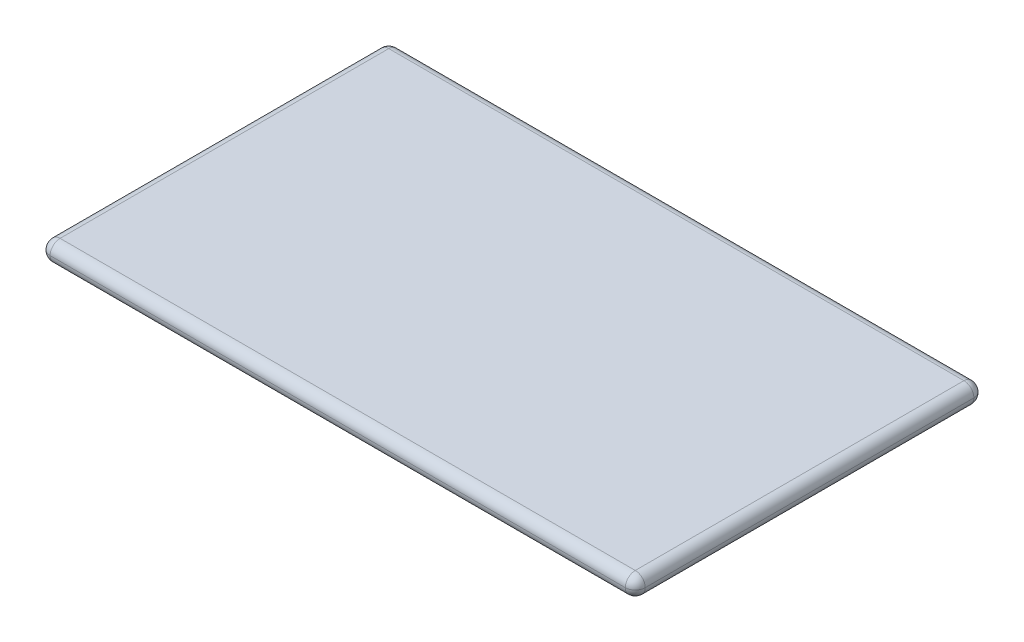
ISO-10303-21;
HEADER;
FILE_DESCRIPTION(('STEP AP214'),'2;1');
FILE_NAME('part.step','',(''),(''),'','','');
FILE_SCHEMA(('AUTOMOTIVE_DESIGN { 1 0 10303 214 1 1 1 1 }'));
ENDSEC;
DATA;
#1=APPLICATION_CONTEXT('core data for automotive mechanical design processes');
#2=APPLICATION_PROTOCOL_DEFINITION('international standard','automotive_design',2000,#1);
#3=PRODUCT_CONTEXT('',#1,'mechanical');
#4=PRODUCT('Part','Part','',(#3));
#5=PRODUCT_RELATED_PRODUCT_CATEGORY('part','',(#4));
#6=PRODUCT_DEFINITION_FORMATION('','',#4);
#7=PRODUCT_DEFINITION_CONTEXT('part definition',#1,'design');
#8=PRODUCT_DEFINITION('design','',#6,#7);
#9=PRODUCT_DEFINITION_SHAPE('','',#8);
#10=(LENGTH_UNIT() NAMED_UNIT(*) SI_UNIT(.MILLI.,.METRE.));
#11=(NAMED_UNIT(*) PLANE_ANGLE_UNIT() SI_UNIT($,.RADIAN.));
#12=(NAMED_UNIT(*) SI_UNIT($,.STERADIAN.) SOLID_ANGLE_UNIT());
#13=UNCERTAINTY_MEASURE_WITH_UNIT(LENGTH_MEASURE(1.E-05),#10,'distance_accuracy_value','');
#14=(GEOMETRIC_REPRESENTATION_CONTEXT(3) GLOBAL_UNCERTAINTY_ASSIGNED_CONTEXT((#13)) GLOBAL_UNIT_ASSIGNED_CONTEXT((#10,
#11,#12)) REPRESENTATION_CONTEXT('',''));
#15=CARTESIAN_POINT('',(0.,0.,0.));
#16=DIRECTION('',(0.,0.,1.));
#17=DIRECTION('',(1.,0.,0.));
#18=AXIS2_PLACEMENT_3D('',#15,#16,#17);
#19=CARTESIAN_POINT('',(0.,0.2032,3.556));
#20=DIRECTION('',(0.,1.,0.));
#21=DIRECTION('',(-1.,0.,0.));
#22=AXIS2_PLACEMENT_3D('',#19,#20,#21);
#23=PLANE('',#22);
#24=DIRECTION('',(0.,0.,-1.));
#25=VECTOR('',#24,1.);
#26=CARTESIAN_POINT('',(5.8674,0.2032,3.556));
#27=LINE('',#26,#25);
#28=CARTESIAN_POINT('',(5.8674,0.2032,3.3528));
#29=VERTEX_POINT('',#28);
#30=CARTESIAN_POINT('',(5.8674,0.2032,-3.3528));
#31=VERTEX_POINT('',#30);
#32=EDGE_CURVE('E45',#29,#31,#27,.T.);
#33=ORIENTED_EDGE('',*,*,#32,.T.);
#34=DIRECTION('',(1.,0.,0.));
#35=VECTOR('',#34,1.);
#36=CARTESIAN_POINT('',(-6.0706,0.2032,-3.3528));
#37=LINE('',#36,#35);
#38=CARTESIAN_POINT('',(-5.8674,0.2032,-3.3528));
#39=VERTEX_POINT('',#38);
#40=EDGE_CURVE('E11',#31,#39,#37,.F.);
#41=ORIENTED_EDGE('',*,*,#40,.T.);
#42=DIRECTION('',(0.,0.,-1.));
#43=VECTOR('',#42,1.);
#44=CARTESIAN_POINT('',(-5.8674,0.2032,3.556));
#45=LINE('',#44,#43);
#46=CARTESIAN_POINT('',(-5.8674,0.2032,3.3528));
#47=VERTEX_POINT('',#46);
#48=EDGE_CURVE('E117',#39,#47,#45,.F.);
#49=ORIENTED_EDGE('',*,*,#48,.T.);
#50=DIRECTION('',(1.,0.,0.));
#51=VECTOR('',#50,1.);
#52=CARTESIAN_POINT('',(0.,0.2032,3.3528));
#53=LINE('',#52,#51);
#54=EDGE_CURVE('E115',#47,#29,#53,.T.);
#55=ORIENTED_EDGE('',*,*,#54,.T.);
#56=EDGE_LOOP('',(#33,#41,#49,#55));
#57=FACE_BOUND('',#56,.T.);
#58=ADVANCED_FACE('F35',(#57),#23,.T.);
#59=CARTESIAN_POINT('',(0.,-0.2032,3.556));
#60=DIRECTION('',(0.,1.,0.));
#61=DIRECTION('',(-1.,0.,0.));
#62=AXIS2_PLACEMENT_3D('',#59,#60,#61);
#63=PLANE('',#62);
#64=DIRECTION('',(0.,0.,-1.));
#65=VECTOR('',#64,1.);
#66=CARTESIAN_POINT('',(-5.8674,-0.2032,3.556));
#67=LINE('',#66,#65);
#68=CARTESIAN_POINT('',(-5.8674,-0.2032,3.3528));
#69=VERTEX_POINT('',#68);
#70=CARTESIAN_POINT('',(-5.8674,-0.2032,-3.3528));
#71=VERTEX_POINT('',#70);
#72=EDGE_CURVE('E190',#69,#71,#67,.T.);
#73=ORIENTED_EDGE('',*,*,#72,.T.);
#74=DIRECTION('',(1.,0.,0.));
#75=VECTOR('',#74,1.);
#76=CARTESIAN_POINT('',(0.,-0.2032,-3.3528));
#77=LINE('',#76,#75);
#78=CARTESIAN_POINT('',(5.8674,-0.2032,-3.3528));
#79=VERTEX_POINT('',#78);
#80=EDGE_CURVE('E121',#71,#79,#77,.T.);
#81=ORIENTED_EDGE('',*,*,#80,.T.);
#82=DIRECTION('',(0.,0.,-1.));
#83=VECTOR('',#82,1.);
#84=CARTESIAN_POINT('',(5.8674,-0.2032,3.556));
#85=LINE('',#84,#83);
#86=CARTESIAN_POINT('',(5.8674,-0.2032,3.3528));
#87=VERTEX_POINT('',#86);
#88=EDGE_CURVE('E196',#79,#87,#85,.F.);
#89=ORIENTED_EDGE('',*,*,#88,.T.);
#90=DIRECTION('',(1.,0.,0.));
#91=VECTOR('',#90,1.);
#92=CARTESIAN_POINT('',(-6.0706,-0.2032,3.3528));
#93=LINE('',#92,#91);
#94=EDGE_CURVE('E187',#87,#69,#93,.F.);
#95=ORIENTED_EDGE('',*,*,#94,.T.);
#96=EDGE_LOOP('',(#73,#81,#89,#95));
#97=FACE_BOUND('',#96,.T.);
#98=ADVANCED_FACE('F202',(#97),#63,.F.);
#99=CARTESIAN_POINT('',(-5.8674,0.,3.556));
#100=DIRECTION('',(0.,0.,1.));
#101=DIRECTION('',(1.,0.,0.));
#102=AXIS2_PLACEMENT_3D('',#99,#100,#101);
#103=CYLINDRICAL_SURFACE('',#102,0.2032);
#104=DIRECTION('',(0.,0.,-1.));
#105=VECTOR('',#104,1.);
#106=CARTESIAN_POINT('',(-6.0706,0.,-3.556));
#107=LINE('',#106,#105);
#108=CARTESIAN_POINT('',(-6.0706,0.,3.3528));
#109=VERTEX_POINT('',#108);
#110=CARTESIAN_POINT('',(-6.0706,0.,-3.3528));
#111=VERTEX_POINT('',#110);
#112=EDGE_CURVE('E180',#109,#111,#107,.T.);
#113=ORIENTED_EDGE('',*,*,#112,.F.);
#114=CARTESIAN_POINT('',(-5.8674,0.,3.3528));
#115=DIRECTION('',(0.,0.,1.));
#116=DIRECTION('',(1.,0.,0.));
#117=AXIS2_PLACEMENT_3D('',#114,#115,#116);
#118=CIRCLE('',#117,0.2032);
#119=EDGE_CURVE('E39',#47,#109,#118,.T.);
#120=ORIENTED_EDGE('',*,*,#119,.F.);
#121=ORIENTED_EDGE('',*,*,#48,.F.);
#122=CARTESIAN_POINT('',(-5.8674,0.,-3.3528));
#123=DIRECTION('',(0.,0.,-1.));
#124=DIRECTION('',(0.,1.,0.));
#125=AXIS2_PLACEMENT_3D('',#122,#123,#124);
#126=CIRCLE('',#125,0.2032);
#127=EDGE_CURVE('E82',#111,#39,#126,.T.);
#128=ORIENTED_EDGE('',*,*,#127,.F.);
#129=EDGE_LOOP('',(#113,#120,#121,#128));
#130=FACE_BOUND('',#129,.T.);
#131=ADVANCED_FACE('F37',(#130),#103,.T.);
#132=CARTESIAN_POINT('',(-5.8674,0.,3.3528));
#133=DIRECTION('',(0.,0.,1.));
#134=DIRECTION('',(1.,0.,0.));
#135=AXIS2_PLACEMENT_3D('',#132,#133,#134);
#136=SPHERICAL_SURFACE('',#135,0.2032);
#137=ORIENTED_EDGE('',*,*,#119,.T.);
#138=CARTESIAN_POINT('',(-5.8674,0.,3.3528));
#139=DIRECTION('',(0.,-1.,0.));
#140=DIRECTION('',(1.,0.,0.));
#141=AXIS2_PLACEMENT_3D('',#138,#139,#140);
#142=CIRCLE('',#141,0.2032);
#143=CARTESIAN_POINT('',(-5.8674,0.,3.556));
#144=VERTEX_POINT('',#143);
#145=EDGE_CURVE('E89',#144,#109,#142,.T.);
#146=ORIENTED_EDGE('',*,*,#145,.F.);
#147=CARTESIAN_POINT('',(-5.8674,0.,3.3528));
#148=DIRECTION('',(-1.,0.,0.));
#149=DIRECTION('',(0.,0.,1.));
#150=AXIS2_PLACEMENT_3D('',#147,#148,#149);
#151=CIRCLE('',#150,0.2032);
#152=EDGE_CURVE('E175',#47,#144,#151,.F.);
#153=ORIENTED_EDGE('',*,*,#152,.F.);
#154=EDGE_LOOP('',(#137,#146,#153));
#155=FACE_BOUND('',#154,.T.);
#156=ADVANCED_FACE('F217',(#155),#136,.T.);
#157=CARTESIAN_POINT('',(-5.8674,0.,-3.3528));
#158=DIRECTION('',(0.,0.,1.));
#159=DIRECTION('',(1.,0.,0.));
#160=AXIS2_PLACEMENT_3D('',#157,#158,#159);
#161=SPHERICAL_SURFACE('',#160,0.2032);
#162=CARTESIAN_POINT('',(-5.8674,0.,-3.3528));
#163=DIRECTION('',(0.,1.,0.));
#164=DIRECTION('',(-1.,0.,0.));
#165=AXIS2_PLACEMENT_3D('',#162,#163,#164);
#166=CIRCLE('',#165,0.2032);
#167=CARTESIAN_POINT('',(-5.8674,0.,-3.556));
#168=VERTEX_POINT('',#167);
#169=EDGE_CURVE('E183',#111,#168,#166,.F.);
#170=ORIENTED_EDGE('',*,*,#169,.F.);
#171=ORIENTED_EDGE('',*,*,#127,.T.);
#172=CARTESIAN_POINT('',(-5.8674,0.,-3.3528));
#173=DIRECTION('',(-1.,0.,0.));
#174=DIRECTION('',(0.,0.,1.));
#175=AXIS2_PLACEMENT_3D('',#172,#173,#174);
#176=CIRCLE('',#175,0.2032);
#177=EDGE_CURVE('E172',#168,#39,#176,.F.);
#178=ORIENTED_EDGE('',*,*,#177,.F.);
#179=EDGE_LOOP('',(#170,#171,#178));
#180=FACE_BOUND('',#179,.T.);
#181=ADVANCED_FACE('F327',(#180),#161,.T.);
#182=CARTESIAN_POINT('',(-5.8674,0.,3.556));
#183=DIRECTION('',(0.,0.,-1.));
#184=DIRECTION('',(-1.,0.,0.));
#185=AXIS2_PLACEMENT_3D('',#182,#183,#184);
#186=CYLINDRICAL_SURFACE('',#185,0.2032);
#187=CARTESIAN_POINT('',(-5.8674,0.,3.3528));
#188=DIRECTION('',(0.,0.,1.));
#189=DIRECTION('',(1.,0.,0.));
#190=AXIS2_PLACEMENT_3D('',#187,#188,#189);
#191=CIRCLE('',#190,0.2032);
#192=EDGE_CURVE('E178',#109,#69,#191,.T.);
#193=ORIENTED_EDGE('',*,*,#192,.F.);
#194=ORIENTED_EDGE('',*,*,#112,.T.);
#195=CARTESIAN_POINT('',(-5.8674,0.,-3.3528));
#196=DIRECTION('',(0.,0.,-1.));
#197=DIRECTION('',(-1.,0.,0.));
#198=AXIS2_PLACEMENT_3D('',#195,#196,#197);
#199=CIRCLE('',#198,0.2032);
#200=EDGE_CURVE('E169',#71,#111,#199,.T.);
#201=ORIENTED_EDGE('',*,*,#200,.F.);
#202=ORIENTED_EDGE('',*,*,#72,.F.);
#203=EDGE_LOOP('',(#193,#194,#201,#202));
#204=FACE_BOUND('',#203,.T.);
#205=ADVANCED_FACE('F319',(#204),#186,.T.);
#206=CARTESIAN_POINT('',(-5.8674,0.,3.3528));
#207=DIRECTION('',(0.,0.,1.));
#208=DIRECTION('',(1.,0.,0.));
#209=AXIS2_PLACEMENT_3D('',#206,#207,#208);
#210=SPHERICAL_SURFACE('',#209,0.2032);
#211=ORIENTED_EDGE('',*,*,#145,.T.);
#212=ORIENTED_EDGE('',*,*,#192,.T.);
#213=CARTESIAN_POINT('',(-5.8674,0.,3.3528));
#214=DIRECTION('',(-1.,0.,0.));
#215=DIRECTION('',(0.,0.,1.));
#216=AXIS2_PLACEMENT_3D('',#213,#214,#215);
#217=CIRCLE('',#216,0.2032);
#218=EDGE_CURVE('E166',#144,#69,#217,.F.);
#219=ORIENTED_EDGE('',*,*,#218,.F.);
#220=EDGE_LOOP('',(#211,#212,#219));
#221=FACE_BOUND('',#220,.T.);
#222=ADVANCED_FACE('F218',(#221),#210,.T.);
#223=CARTESIAN_POINT('',(0.,0.,3.3528));
#224=DIRECTION('',(1.,0.,0.));
#225=DIRECTION('',(0.,1.,0.));
#226=AXIS2_PLACEMENT_3D('',#223,#224,#225);
#227=CYLINDRICAL_SURFACE('',#226,0.2032);
#228=ORIENTED_EDGE('',*,*,#54,.F.);
#229=ORIENTED_EDGE('',*,*,#152,.T.);
#230=DIRECTION('',(1.,0.,0.));
#231=VECTOR('',#230,1.);
#232=CARTESIAN_POINT('',(0.,0.,3.556));
#233=LINE('',#232,#231);
#234=CARTESIAN_POINT('',(5.8674,0.,3.556));
#235=VERTEX_POINT('',#234);
#236=EDGE_CURVE('E128',#235,#144,#233,.F.);
#237=ORIENTED_EDGE('',*,*,#236,.F.);
#238=CARTESIAN_POINT('',(5.8674,0.,3.3528));
#239=DIRECTION('',(1.,0.,0.));
#240=DIRECTION('',(0.,0.,-1.));
#241=AXIS2_PLACEMENT_3D('',#238,#239,#240);
#242=CIRCLE('',#241,0.2032);
#243=EDGE_CURVE('E124',#29,#235,#242,.T.);
#244=ORIENTED_EDGE('',*,*,#243,.F.);
#245=EDGE_LOOP('',(#228,#229,#237,#244));
#246=FACE_BOUND('',#245,.T.);
#247=ADVANCED_FACE('F126',(#246),#227,.T.);
#248=CARTESIAN_POINT('',(0.,0.,-3.3528));
#249=DIRECTION('',(-1.,0.,0.));
#250=DIRECTION('',(0.,-1.,0.));
#251=AXIS2_PLACEMENT_3D('',#248,#249,#250);
#252=CYLINDRICAL_SURFACE('',#251,0.2032);
#253=ORIENTED_EDGE('',*,*,#177,.T.);
#254=ORIENTED_EDGE('',*,*,#40,.F.);
#255=CARTESIAN_POINT('',(5.8674,0.,-3.3528));
#256=DIRECTION('',(1.,0.,0.));
#257=DIRECTION('',(0.,0.,-1.));
#258=AXIS2_PLACEMENT_3D('',#255,#256,#257);
#259=CIRCLE('',#258,0.2032);
#260=CARTESIAN_POINT('',(5.8674,0.,-3.556));
#261=VERTEX_POINT('',#260);
#262=EDGE_CURVE('E131',#261,#31,#259,.T.);
#263=ORIENTED_EDGE('',*,*,#262,.F.);
#264=DIRECTION('',(1.,0.,0.));
#265=VECTOR('',#264,1.);
#266=CARTESIAN_POINT('',(6.0706,0.,-3.556));
#267=LINE('',#266,#265);
#268=EDGE_CURVE('E158',#168,#261,#267,.T.);
#269=ORIENTED_EDGE('',*,*,#268,.F.);
#270=EDGE_LOOP('',(#253,#254,#263,#269));
#271=FACE_BOUND('',#270,.T.);
#272=ADVANCED_FACE('F216',(#271),#252,.T.);
#273=CARTESIAN_POINT('',(-5.8674,0.,-3.3528));
#274=DIRECTION('',(0.,0.,1.));
#275=DIRECTION('',(1.,0.,0.));
#276=AXIS2_PLACEMENT_3D('',#273,#274,#275);
#277=SPHERICAL_SURFACE('',#276,0.2032);
#278=ORIENTED_EDGE('',*,*,#200,.T.);
#279=ORIENTED_EDGE('',*,*,#169,.T.);
#280=CARTESIAN_POINT('',(-5.8674,0.,-3.3528));
#281=DIRECTION('',(-1.,0.,0.));
#282=DIRECTION('',(0.,0.,1.));
#283=AXIS2_PLACEMENT_3D('',#280,#281,#282);
#284=CIRCLE('',#283,0.2032);
#285=EDGE_CURVE('E155',#71,#168,#284,.F.);
#286=ORIENTED_EDGE('',*,*,#285,.F.);
#287=EDGE_LOOP('',(#278,#279,#286));
#288=FACE_BOUND('',#287,.T.);
#289=ADVANCED_FACE('F289',(#288),#277,.T.);
#290=CARTESIAN_POINT('',(0.,0.,3.3528));
#291=DIRECTION('',(-1.,0.,0.));
#292=DIRECTION('',(0.,-1.,0.));
#293=AXIS2_PLACEMENT_3D('',#290,#291,#292);
#294=CYLINDRICAL_SURFACE('',#293,0.2032);
#295=CARTESIAN_POINT('',(5.8674,0.,3.3528));
#296=DIRECTION('',(1.,0.,0.));
#297=DIRECTION('',(0.,0.,-1.));
#298=AXIS2_PLACEMENT_3D('',#295,#296,#297);
#299=CIRCLE('',#298,0.2032);
#300=EDGE_CURVE('E153',#235,#87,#299,.T.);
#301=ORIENTED_EDGE('',*,*,#300,.F.);
#302=ORIENTED_EDGE('',*,*,#236,.T.);
#303=ORIENTED_EDGE('',*,*,#218,.T.);
#304=ORIENTED_EDGE('',*,*,#94,.F.);
#305=EDGE_LOOP('',(#301,#302,#303,#304));
#306=FACE_BOUND('',#305,.T.);
#307=ADVANCED_FACE('F221',(#306),#294,.T.);
#308=CARTESIAN_POINT('',(5.8674,0.,3.3528));
#309=DIRECTION('',(0.,0.,1.));
#310=DIRECTION('',(1.,0.,0.));
#311=AXIS2_PLACEMENT_3D('',#308,#309,#310);
#312=SPHERICAL_SURFACE('',#311,0.2032);
#313=ORIENTED_EDGE('',*,*,#243,.T.);
#314=CARTESIAN_POINT('',(5.8674,0.,3.3528));
#315=DIRECTION('',(0.,-1.,0.));
#316=DIRECTION('',(0.,0.,-1.));
#317=AXIS2_PLACEMENT_3D('',#314,#315,#316);
#318=CIRCLE('',#317,0.2032);
#319=CARTESIAN_POINT('',(6.0706,0.,3.3528));
#320=VERTEX_POINT('',#319);
#321=EDGE_CURVE('E136',#320,#235,#318,.T.);
#322=ORIENTED_EDGE('',*,*,#321,.F.);
#323=CARTESIAN_POINT('',(5.8674,0.,3.3528));
#324=DIRECTION('',(0.,0.,1.));
#325=DIRECTION('',(1.,0.,0.));
#326=AXIS2_PLACEMENT_3D('',#323,#324,#325);
#327=CIRCLE('',#326,0.2032);
#328=EDGE_CURVE('E134',#29,#320,#327,.F.);
#329=ORIENTED_EDGE('',*,*,#328,.F.);
#330=EDGE_LOOP('',(#313,#322,#329));
#331=FACE_BOUND('',#330,.T.);
#332=ADVANCED_FACE('F135',(#331),#312,.T.);
#333=CARTESIAN_POINT('',(5.8674,0.,-3.3528));
#334=DIRECTION('',(0.,0.,1.));
#335=DIRECTION('',(1.,0.,0.));
#336=AXIS2_PLACEMENT_3D('',#333,#334,#335);
#337=SPHERICAL_SURFACE('',#336,0.2032);
#338=CARTESIAN_POINT('',(5.8674,0.,-3.3528));
#339=DIRECTION('',(0.,1.,0.));
#340=DIRECTION('',(0.,0.,1.));
#341=AXIS2_PLACEMENT_3D('',#338,#339,#340);
#342=CIRCLE('',#341,0.2032);
#343=CARTESIAN_POINT('',(6.0706,0.,-3.3528));
#344=VERTEX_POINT('',#343);
#345=EDGE_CURVE('E161',#261,#344,#342,.F.);
#346=ORIENTED_EDGE('',*,*,#345,.F.);
#347=ORIENTED_EDGE('',*,*,#262,.T.);
#348=CARTESIAN_POINT('',(5.8674,0.,-3.3528));
#349=DIRECTION('',(0.,0.,-1.));
#350=DIRECTION('',(-1.,0.,0.));
#351=AXIS2_PLACEMENT_3D('',#348,#349,#350);
#352=CIRCLE('',#351,0.2032);
#353=EDGE_CURVE('E54',#344,#31,#352,.F.);
#354=ORIENTED_EDGE('',*,*,#353,.F.);
#355=EDGE_LOOP('',(#346,#347,#354));
#356=FACE_BOUND('',#355,.T.);
#357=ADVANCED_FACE('F213',(#356),#337,.T.);
#358=CARTESIAN_POINT('',(0.,0.,-3.3528));
#359=DIRECTION('',(1.,0.,0.));
#360=DIRECTION('',(0.,1.,0.));
#361=AXIS2_PLACEMENT_3D('',#358,#359,#360);
#362=CYLINDRICAL_SURFACE('',#361,0.2032);
#363=ORIENTED_EDGE('',*,*,#285,.T.);
#364=ORIENTED_EDGE('',*,*,#268,.T.);
#365=CARTESIAN_POINT('',(5.8674,0.,-3.3528));
#366=DIRECTION('',(1.,0.,0.));
#367=DIRECTION('',(0.,0.,-1.));
#368=AXIS2_PLACEMENT_3D('',#365,#366,#367);
#369=CIRCLE('',#368,0.2032);
#370=EDGE_CURVE('E148',#79,#261,#369,.T.);
#371=ORIENTED_EDGE('',*,*,#370,.F.);
#372=ORIENTED_EDGE('',*,*,#80,.F.);
#373=EDGE_LOOP('',(#363,#364,#371,#372));
#374=FACE_BOUND('',#373,.T.);
#375=ADVANCED_FACE('F205',(#374),#362,.T.);
#376=CARTESIAN_POINT('',(5.8674,0.,3.3528));
#377=DIRECTION('',(0.,0.,1.));
#378=DIRECTION('',(1.,0.,0.));
#379=AXIS2_PLACEMENT_3D('',#376,#377,#378);
#380=SPHERICAL_SURFACE('',#379,0.2032);
#381=ORIENTED_EDGE('',*,*,#321,.T.);
#382=ORIENTED_EDGE('',*,*,#300,.T.);
#383=CARTESIAN_POINT('',(5.8674,0.,3.3528));
#384=DIRECTION('',(0.,0.,1.));
#385=DIRECTION('',(1.,0.,0.));
#386=AXIS2_PLACEMENT_3D('',#383,#384,#385);
#387=CIRCLE('',#386,0.2032);
#388=EDGE_CURVE('E98',#320,#87,#387,.F.);
#389=ORIENTED_EDGE('',*,*,#388,.F.);
#390=EDGE_LOOP('',(#381,#382,#389));
#391=FACE_BOUND('',#390,.T.);
#392=ADVANCED_FACE('F223',(#391),#380,.T.);
#393=CARTESIAN_POINT('',(5.8674,0.,3.556));
#394=DIRECTION('',(0.,0.,-1.));
#395=DIRECTION('',(-1.,0.,0.));
#396=AXIS2_PLACEMENT_3D('',#393,#394,#395);
#397=CYLINDRICAL_SURFACE('',#396,0.2032);
#398=ORIENTED_EDGE('',*,*,#32,.F.);
#399=ORIENTED_EDGE('',*,*,#328,.T.);
#400=DIRECTION('',(0.,0.,-1.));
#401=VECTOR('',#400,1.);
#402=CARTESIAN_POINT('',(6.0706,0.,3.556));
#403=LINE('',#402,#401);
#404=EDGE_CURVE('E145',#344,#320,#403,.F.);
#405=ORIENTED_EDGE('',*,*,#404,.F.);
#406=ORIENTED_EDGE('',*,*,#353,.T.);
#407=EDGE_LOOP('',(#398,#399,#405,#406));
#408=FACE_BOUND('',#407,.T.);
#409=ADVANCED_FACE('F138',(#408),#397,.T.);
#410=CARTESIAN_POINT('',(5.8674,0.,-3.3528));
#411=DIRECTION('',(0.,0.,1.));
#412=DIRECTION('',(1.,0.,0.));
#413=AXIS2_PLACEMENT_3D('',#410,#411,#412);
#414=SPHERICAL_SURFACE('',#413,0.2032);
#415=ORIENTED_EDGE('',*,*,#370,.T.);
#416=ORIENTED_EDGE('',*,*,#345,.T.);
#417=CARTESIAN_POINT('',(5.8674,0.,-3.3528));
#418=DIRECTION('',(0.,0.,-1.));
#419=DIRECTION('',(0.,1.,0.));
#420=AXIS2_PLACEMENT_3D('',#417,#418,#419);
#421=CIRCLE('',#420,0.2032);
#422=EDGE_CURVE('E142',#79,#344,#421,.F.);
#423=ORIENTED_EDGE('',*,*,#422,.F.);
#424=EDGE_LOOP('',(#415,#416,#423));
#425=FACE_BOUND('',#424,.T.);
#426=ADVANCED_FACE('F210',(#425),#414,.T.);
#427=CARTESIAN_POINT('',(5.8674,0.,3.556));
#428=DIRECTION('',(0.,0.,1.));
#429=DIRECTION('',(1.,0.,0.));
#430=AXIS2_PLACEMENT_3D('',#427,#428,#429);
#431=CYLINDRICAL_SURFACE('',#430,0.2032);
#432=ORIENTED_EDGE('',*,*,#388,.T.);
#433=ORIENTED_EDGE('',*,*,#88,.F.);
#434=ORIENTED_EDGE('',*,*,#422,.T.);
#435=ORIENTED_EDGE('',*,*,#404,.T.);
#436=EDGE_LOOP('',(#432,#433,#434,#435));
#437=FACE_BOUND('',#436,.T.);
#438=ADVANCED_FACE('F209',(#437),#431,.T.);
#439=CLOSED_SHELL('',(#58,#98,#131,#156,#181,#205,#222,#247,#272,#289,#307,#332,#357,#375,#392,
#409,#426,#438));
#440=MANIFOLD_SOLID_BREP('B2',#439);
#441=ADVANCED_BREP_SHAPE_REPRESENTATION('',(#18,#440),#14);
#442=SHAPE_DEFINITION_REPRESENTATION(#9,#441);
ENDSEC;
END-ISO-10303-21;
